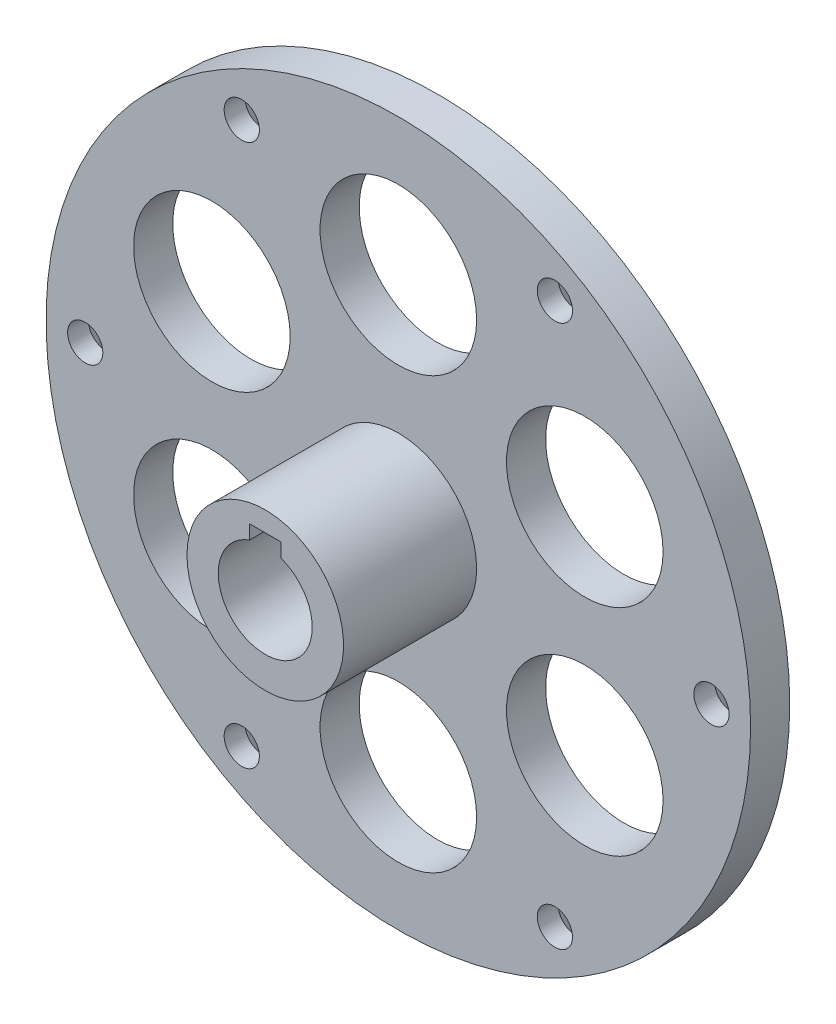
ISO-10303-21;
HEADER;
FILE_DESCRIPTION(('STEP AP214'),'2;1');
FILE_NAME('part.step','',(''),(''),'','','');
FILE_SCHEMA(('AUTOMOTIVE_DESIGN { 1 0 10303 214 1 1 1 1 }'));
ENDSEC;
DATA;
#1=APPLICATION_CONTEXT('core data for automotive mechanical design processes');
#2=APPLICATION_PROTOCOL_DEFINITION('international standard','automotive_design',2000,#1);
#3=PRODUCT_CONTEXT('',#1,'mechanical');
#4=PRODUCT('Part','Part','',(#3));
#5=PRODUCT_RELATED_PRODUCT_CATEGORY('part','',(#4));
#6=PRODUCT_DEFINITION_FORMATION('','',#4);
#7=PRODUCT_DEFINITION_CONTEXT('part definition',#1,'design');
#8=PRODUCT_DEFINITION('design','',#6,#7);
#9=PRODUCT_DEFINITION_SHAPE('','',#8);
#10=(LENGTH_UNIT() NAMED_UNIT(*) SI_UNIT(.MILLI.,.METRE.));
#11=(NAMED_UNIT(*) PLANE_ANGLE_UNIT() SI_UNIT($,.RADIAN.));
#12=(NAMED_UNIT(*) SI_UNIT($,.STERADIAN.) SOLID_ANGLE_UNIT());
#13=UNCERTAINTY_MEASURE_WITH_UNIT(LENGTH_MEASURE(1.E-05),#10,'distance_accuracy_value','');
#14=(GEOMETRIC_REPRESENTATION_CONTEXT(3) GLOBAL_UNCERTAINTY_ASSIGNED_CONTEXT((#13)) GLOBAL_UNIT_ASSIGNED_CONTEXT((#10,
#11,#12)) REPRESENTATION_CONTEXT('',''));
#15=CARTESIAN_POINT('',(0.,0.,0.));
#16=DIRECTION('',(0.,0.,1.));
#17=DIRECTION('',(1.,0.,0.));
#18=AXIS2_PLACEMENT_3D('',#15,#16,#17);
#19=CARTESIAN_POINT('',(0.,0.,5.));
#20=DIRECTION('',(0.,0.,1.));
#21=DIRECTION('',(1.,0.,0.));
#22=AXIS2_PLACEMENT_3D('',#19,#20,#21);
#23=PLANE('',#22);
#24=CARTESIAN_POINT('',(-40.,4.71844785465692E-13,5.));
#25=DIRECTION('',(0.,0.,1.));
#26=DIRECTION('',(1.,0.,0.));
#27=AXIS2_PLACEMENT_3D('',#24,#25,#26);
#28=CIRCLE('',#27,2.25);
#29=CARTESIAN_POINT('',(-37.75,4.71844785465692E-13,5.));
#30=VERTEX_POINT('',#29);
#31=EDGE_CURVE('E36',#30,#30,#28,.T.);
#32=ORIENTED_EDGE('',*,*,#31,.F.);
#33=EDGE_LOOP('',(#32));
#34=FACE_BOUND('',#33,.T.);
#35=CARTESIAN_POINT('',(-20.0000000000003,-34.6410161513774,5.));
#36=DIRECTION('',(0.,0.,1.));
#37=DIRECTION('',(1.,0.,0.));
#38=AXIS2_PLACEMENT_3D('',#35,#36,#37);
#39=CIRCLE('',#38,2.25);
#40=CARTESIAN_POINT('',(-17.7500000000003,-34.6410161513774,5.));
#41=VERTEX_POINT('',#40);
#42=EDGE_CURVE('E151',#41,#41,#39,.T.);
#43=ORIENTED_EDGE('',*,*,#42,.F.);
#44=EDGE_LOOP('',(#43));
#45=FACE_BOUND('',#44,.T.);
#46=CARTESIAN_POINT('',(19.9999999999998,-34.6410161513777,5.));
#47=DIRECTION('',(0.,0.,1.));
#48=DIRECTION('',(1.,0.,0.));
#49=AXIS2_PLACEMENT_3D('',#46,#47,#48);
#50=CIRCLE('',#49,2.25);
#51=CARTESIAN_POINT('',(22.2499999999997,-34.6410161513777,5.));
#52=VERTEX_POINT('',#51);
#53=EDGE_CURVE('E147',#52,#52,#50,.T.);
#54=ORIENTED_EDGE('',*,*,#53,.F.);
#55=EDGE_LOOP('',(#54));
#56=FACE_BOUND('',#55,.T.);
#57=CARTESIAN_POINT('',(40.,-1.90819582357449E-13,5.));
#58=DIRECTION('',(0.,0.,1.));
#59=DIRECTION('',(1.,0.,0.));
#60=AXIS2_PLACEMENT_3D('',#57,#58,#59);
#61=CIRCLE('',#60,2.25);
#62=CARTESIAN_POINT('',(42.25,-1.90819582357449E-13,5.));
#63=VERTEX_POINT('',#62);
#64=EDGE_CURVE('E142',#63,#63,#61,.T.);
#65=ORIENTED_EDGE('',*,*,#64,.F.);
#66=EDGE_LOOP('',(#65));
#67=FACE_BOUND('',#66,.T.);
#68=CARTESIAN_POINT('',(20.0000000000001,34.6410161513775,5.));
#69=DIRECTION('',(0.,0.,1.));
#70=DIRECTION('',(1.,0.,0.));
#71=AXIS2_PLACEMENT_3D('',#68,#69,#70);
#72=CIRCLE('',#71,2.25);
#73=CARTESIAN_POINT('',(22.2500000000001,34.6410161513775,5.));
#74=VERTEX_POINT('',#73);
#75=EDGE_CURVE('E137',#74,#74,#72,.T.);
#76=ORIENTED_EDGE('',*,*,#75,.F.);
#77=EDGE_LOOP('',(#76));
#78=FACE_BOUND('',#77,.T.);
#79=CARTESIAN_POINT('',(-20.,34.6410161513775,5.));
#80=DIRECTION('',(0.,0.,1.));
#81=DIRECTION('',(1.,0.,0.));
#82=AXIS2_PLACEMENT_3D('',#79,#80,#81);
#83=CIRCLE('',#82,2.25);
#84=CARTESIAN_POINT('',(-17.75,34.6410161513775,5.));
#85=VERTEX_POINT('',#84);
#86=EDGE_CURVE('E84',#85,#85,#83,.T.);
#87=ORIENTED_EDGE('',*,*,#86,.F.);
#88=EDGE_LOOP('',(#87));
#89=FACE_BOUND('',#88,.T.);
#90=CARTESIAN_POINT('',(-23.8156986040721,13.75,5.));
#91=DIRECTION('',(0.,0.,1.));
#92=DIRECTION('',(1.,0.,0.));
#93=AXIS2_PLACEMENT_3D('',#90,#91,#92);
#94=CIRCLE('',#93,10.);
#95=CARTESIAN_POINT('',(-13.8156986040721,13.75,5.));
#96=VERTEX_POINT('',#95);
#97=EDGE_CURVE('E133',#96,#96,#94,.T.);
#98=ORIENTED_EDGE('',*,*,#97,.F.);
#99=EDGE_LOOP('',(#98));
#100=FACE_BOUND('',#99,.T.);
#101=CARTESIAN_POINT('',(-23.8156986040721,-13.75,5.));
#102=DIRECTION('',(0.,0.,1.));
#103=DIRECTION('',(1.,0.,0.));
#104=AXIS2_PLACEMENT_3D('',#101,#102,#103);
#105=CIRCLE('',#104,10.);
#106=CARTESIAN_POINT('',(-13.8156986040721,-13.75,5.));
#107=VERTEX_POINT('',#106);
#108=EDGE_CURVE('E129',#107,#107,#105,.T.);
#109=ORIENTED_EDGE('',*,*,#108,.F.);
#110=EDGE_LOOP('',(#109));
#111=FACE_BOUND('',#110,.T.);
#112=CARTESIAN_POINT('',(0.,-27.5,5.));
#113=DIRECTION('',(0.,0.,1.));
#114=DIRECTION('',(1.,0.,0.));
#115=AXIS2_PLACEMENT_3D('',#112,#113,#114);
#116=CIRCLE('',#115,10.);
#117=CARTESIAN_POINT('',(10.,-27.5,5.));
#118=VERTEX_POINT('',#117);
#119=EDGE_CURVE('E125',#118,#118,#116,.T.);
#120=ORIENTED_EDGE('',*,*,#119,.F.);
#121=EDGE_LOOP('',(#120));
#122=FACE_BOUND('',#121,.T.);
#123=CARTESIAN_POINT('',(23.8156986040721,-13.75,5.));
#124=DIRECTION('',(0.,0.,1.));
#125=DIRECTION('',(1.,0.,0.));
#126=AXIS2_PLACEMENT_3D('',#123,#124,#125);
#127=CIRCLE('',#126,10.);
#128=CARTESIAN_POINT('',(33.8156986040721,-13.75,5.));
#129=VERTEX_POINT('',#128);
#130=EDGE_CURVE('E121',#129,#129,#127,.T.);
#131=ORIENTED_EDGE('',*,*,#130,.F.);
#132=EDGE_LOOP('',(#131));
#133=FACE_BOUND('',#132,.T.);
#134=CARTESIAN_POINT('',(0.,27.5,5.));
#135=DIRECTION('',(0.,0.,1.));
#136=DIRECTION('',(1.,0.,0.));
#137=AXIS2_PLACEMENT_3D('',#134,#135,#136);
#138=CIRCLE('',#137,10.);
#139=CARTESIAN_POINT('',(10.,27.5,5.));
#140=VERTEX_POINT('',#139);
#141=EDGE_CURVE('E117',#140,#140,#138,.T.);
#142=ORIENTED_EDGE('',*,*,#141,.F.);
#143=EDGE_LOOP('',(#142));
#144=FACE_BOUND('',#143,.T.);
#145=CARTESIAN_POINT('',(23.8156986040721,13.75,5.));
#146=DIRECTION('',(0.,0.,1.));
#147=DIRECTION('',(1.,0.,0.));
#148=AXIS2_PLACEMENT_3D('',#145,#146,#147);
#149=CIRCLE('',#148,10.);
#150=CARTESIAN_POINT('',(33.8156986040721,13.75,5.));
#151=VERTEX_POINT('',#150);
#152=EDGE_CURVE('E103',#151,#151,#149,.T.);
#153=ORIENTED_EDGE('',*,*,#152,.F.);
#154=EDGE_LOOP('',(#153));
#155=FACE_BOUND('',#154,.T.);
#156=CARTESIAN_POINT('',(0.,0.,5.));
#157=DIRECTION('',(0.,0.,1.));
#158=DIRECTION('',(1.,0.,0.));
#159=AXIS2_PLACEMENT_3D('',#156,#157,#158);
#160=CIRCLE('',#159,10.);
#161=CARTESIAN_POINT('',(10.,0.,5.));
#162=VERTEX_POINT('',#161);
#163=EDGE_CURVE('E11',#162,#162,#160,.T.);
#164=ORIENTED_EDGE('',*,*,#163,.F.);
#165=EDGE_LOOP('',(#164));
#166=FACE_BOUND('',#165,.T.);
#167=CARTESIAN_POINT('',(0.,0.,5.));
#168=DIRECTION('',(0.,0.,1.));
#169=DIRECTION('',(1.,0.,0.));
#170=AXIS2_PLACEMENT_3D('',#167,#168,#169);
#171=CIRCLE('',#170,45.);
#172=CARTESIAN_POINT('',(45.,0.,5.));
#173=VERTEX_POINT('',#172);
#174=EDGE_CURVE('E41',#173,#173,#171,.T.);
#175=ORIENTED_EDGE('',*,*,#174,.T.);
#176=EDGE_LOOP('',(#175));
#177=FACE_BOUND('',#176,.T.);
#178=ADVANCED_FACE('F32',(#34,#45,#56,#67,#78,#89,#100,#111,#122,#133,#144,#155,#166,#177),#23,.T.);
#179=CARTESIAN_POINT('',(0.,0.,0.));
#180=DIRECTION('',(0.,0.,1.));
#181=DIRECTION('',(1.,0.,0.));
#182=AXIS2_PLACEMENT_3D('',#179,#180,#181);
#183=PLANE('',#182);
#184=CARTESIAN_POINT('',(-40.,4.71844785465692E-13,0.));
#185=DIRECTION('',(0.,0.,-1.));
#186=DIRECTION('',(-1.,0.,0.));
#187=AXIS2_PLACEMENT_3D('',#184,#185,#186);
#188=CIRCLE('',#187,4.59);
#189=CARTESIAN_POINT('',(-44.59,4.71844785465692E-13,0.));
#190=VERTEX_POINT('',#189);
#191=EDGE_CURVE('E459',#190,#190,#188,.T.);
#192=ORIENTED_EDGE('',*,*,#191,.F.);
#193=EDGE_LOOP('',(#192));
#194=FACE_BOUND('',#193,.T.);
#195=CARTESIAN_POINT('',(-20.0000000000003,-34.6410161513774,0.));
#196=DIRECTION('',(0.,0.,-1.));
#197=DIRECTION('',(-1.,0.,0.));
#198=AXIS2_PLACEMENT_3D('',#195,#196,#197);
#199=CIRCLE('',#198,4.59);
#200=CARTESIAN_POINT('',(-24.5900000000003,-34.6410161513774,0.));
#201=VERTEX_POINT('',#200);
#202=EDGE_CURVE('E154',#201,#201,#199,.T.);
#203=ORIENTED_EDGE('',*,*,#202,.F.);
#204=EDGE_LOOP('',(#203));
#205=FACE_BOUND('',#204,.T.);
#206=CARTESIAN_POINT('',(19.9999999999998,-34.6410161513777,0.));
#207=DIRECTION('',(0.,0.,-1.));
#208=DIRECTION('',(-1.,0.,0.));
#209=AXIS2_PLACEMENT_3D('',#206,#207,#208);
#210=CIRCLE('',#209,4.59);
#211=CARTESIAN_POINT('',(15.4099999999997,-34.6410161513777,0.));
#212=VERTEX_POINT('',#211);
#213=EDGE_CURVE('E150',#212,#212,#210,.T.);
#214=ORIENTED_EDGE('',*,*,#213,.F.);
#215=EDGE_LOOP('',(#214));
#216=FACE_BOUND('',#215,.T.);
#217=CARTESIAN_POINT('',(40.,-1.90819582357449E-13,0.));
#218=DIRECTION('',(0.,0.,-1.));
#219=DIRECTION('',(-1.,0.,0.));
#220=AXIS2_PLACEMENT_3D('',#217,#218,#219);
#221=CIRCLE('',#220,4.59);
#222=CARTESIAN_POINT('',(35.41,-1.90819582357449E-13,0.));
#223=VERTEX_POINT('',#222);
#224=EDGE_CURVE('E146',#223,#223,#221,.T.);
#225=ORIENTED_EDGE('',*,*,#224,.F.);
#226=EDGE_LOOP('',(#225));
#227=FACE_BOUND('',#226,.T.);
#228=CARTESIAN_POINT('',(20.0000000000001,34.6410161513775,0.));
#229=DIRECTION('',(0.,0.,-1.));
#230=DIRECTION('',(-1.,0.,0.));
#231=AXIS2_PLACEMENT_3D('',#228,#229,#230);
#232=CIRCLE('',#231,4.59);
#233=CARTESIAN_POINT('',(15.4100000000001,34.6410161513775,0.));
#234=VERTEX_POINT('',#233);
#235=EDGE_CURVE('E141',#234,#234,#232,.T.);
#236=ORIENTED_EDGE('',*,*,#235,.F.);
#237=EDGE_LOOP('',(#236));
#238=FACE_BOUND('',#237,.T.);
#239=CARTESIAN_POINT('',(-20.,34.6410161513775,0.));
#240=DIRECTION('',(0.,0.,-1.));
#241=DIRECTION('',(-1.,0.,0.));
#242=AXIS2_PLACEMENT_3D('',#239,#240,#241);
#243=CIRCLE('',#242,4.59);
#244=CARTESIAN_POINT('',(-24.59,34.6410161513775,0.));
#245=VERTEX_POINT('',#244);
#246=EDGE_CURVE('E136',#245,#245,#243,.T.);
#247=ORIENTED_EDGE('',*,*,#246,.F.);
#248=EDGE_LOOP('',(#247));
#249=FACE_BOUND('',#248,.T.);
#250=CARTESIAN_POINT('',(-23.8156986040721,13.75,0.));
#251=DIRECTION('',(0.,0.,1.));
#252=DIRECTION('',(1.,0.,0.));
#253=AXIS2_PLACEMENT_3D('',#250,#251,#252);
#254=CIRCLE('',#253,10.);
#255=CARTESIAN_POINT('',(-13.8156986040721,13.75,0.));
#256=VERTEX_POINT('',#255);
#257=EDGE_CURVE('E130',#256,#256,#254,.T.);
#258=ORIENTED_EDGE('',*,*,#257,.T.);
#259=EDGE_LOOP('',(#258));
#260=FACE_BOUND('',#259,.T.);
#261=CARTESIAN_POINT('',(-23.8156986040721,-13.75,0.));
#262=DIRECTION('',(0.,0.,1.));
#263=DIRECTION('',(1.,0.,0.));
#264=AXIS2_PLACEMENT_3D('',#261,#262,#263);
#265=CIRCLE('',#264,10.);
#266=CARTESIAN_POINT('',(-13.8156986040721,-13.75,0.));
#267=VERTEX_POINT('',#266);
#268=EDGE_CURVE('E126',#267,#267,#265,.T.);
#269=ORIENTED_EDGE('',*,*,#268,.T.);
#270=EDGE_LOOP('',(#269));
#271=FACE_BOUND('',#270,.T.);
#272=CARTESIAN_POINT('',(0.,-27.5,0.));
#273=DIRECTION('',(0.,0.,1.));
#274=DIRECTION('',(1.,0.,0.));
#275=AXIS2_PLACEMENT_3D('',#272,#273,#274);
#276=CIRCLE('',#275,10.);
#277=CARTESIAN_POINT('',(10.,-27.5,0.));
#278=VERTEX_POINT('',#277);
#279=EDGE_CURVE('E122',#278,#278,#276,.T.);
#280=ORIENTED_EDGE('',*,*,#279,.T.);
#281=EDGE_LOOP('',(#280));
#282=FACE_BOUND('',#281,.T.);
#283=CARTESIAN_POINT('',(23.8156986040721,-13.75,0.));
#284=DIRECTION('',(0.,0.,1.));
#285=DIRECTION('',(1.,0.,0.));
#286=AXIS2_PLACEMENT_3D('',#283,#284,#285);
#287=CIRCLE('',#286,10.);
#288=CARTESIAN_POINT('',(33.8156986040721,-13.75,0.));
#289=VERTEX_POINT('',#288);
#290=EDGE_CURVE('E118',#289,#289,#287,.T.);
#291=ORIENTED_EDGE('',*,*,#290,.T.);
#292=EDGE_LOOP('',(#291));
#293=FACE_BOUND('',#292,.T.);
#294=CARTESIAN_POINT('',(0.,27.5,0.));
#295=DIRECTION('',(0.,0.,1.));
#296=DIRECTION('',(1.,0.,0.));
#297=AXIS2_PLACEMENT_3D('',#294,#295,#296);
#298=CIRCLE('',#297,10.);
#299=CARTESIAN_POINT('',(10.,27.5,0.));
#300=VERTEX_POINT('',#299);
#301=EDGE_CURVE('E114',#300,#300,#298,.T.);
#302=ORIENTED_EDGE('',*,*,#301,.T.);
#303=EDGE_LOOP('',(#302));
#304=FACE_BOUND('',#303,.T.);
#305=CARTESIAN_POINT('',(23.8156986040721,13.75,0.));
#306=DIRECTION('',(0.,0.,1.));
#307=DIRECTION('',(1.,0.,0.));
#308=AXIS2_PLACEMENT_3D('',#305,#306,#307);
#309=CIRCLE('',#308,10.);
#310=CARTESIAN_POINT('',(33.8156986040721,13.75,0.));
#311=VERTEX_POINT('',#310);
#312=EDGE_CURVE('E98',#311,#311,#309,.T.);
#313=ORIENTED_EDGE('',*,*,#312,.T.);
#314=EDGE_LOOP('',(#313));
#315=FACE_BOUND('',#314,.T.);
#316=CARTESIAN_POINT('',(0.,0.,0.));
#317=DIRECTION('',(0.,0.,1.));
#318=DIRECTION('',(1.,0.,0.));
#319=AXIS2_PLACEMENT_3D('',#316,#317,#318);
#320=CIRCLE('',#319,45.);
#321=CARTESIAN_POINT('',(45.,0.,0.));
#322=VERTEX_POINT('',#321);
#323=EDGE_CURVE('E109',#322,#322,#320,.T.);
#324=ORIENTED_EDGE('',*,*,#323,.F.);
#325=EDGE_LOOP('',(#324));
#326=FACE_BOUND('',#325,.T.);
#327=DIRECTION('',(-1.,0.,0.));
#328=VECTOR('',#327,1.);
#329=CARTESIAN_POINT('',(0.,7.45685424949238,0.));
#330=LINE('',#329,#328);
#331=CARTESIAN_POINT('',(2.,7.45685424949238,0.));
#332=VERTEX_POINT('',#331);
#333=CARTESIAN_POINT('',(-2.,7.45685424949238,0.));
#334=VERTEX_POINT('',#333);
#335=EDGE_CURVE('E191',#332,#334,#330,.T.);
#336=ORIENTED_EDGE('',*,*,#335,.T.);
#337=DIRECTION('',(0.,-1.,0.));
#338=VECTOR('',#337,1.);
#339=CARTESIAN_POINT('',(-2.,0.,0.));
#340=LINE('',#339,#338);
#341=CARTESIAN_POINT('',(-2.,5.65685424949238,0.));
#342=VERTEX_POINT('',#341);
#343=EDGE_CURVE('E57',#334,#342,#340,.T.);
#344=ORIENTED_EDGE('',*,*,#343,.T.);
#345=CARTESIAN_POINT('',(0.,0.,0.));
#346=DIRECTION('',(0.,0.,1.));
#347=DIRECTION('',(1.,0.,0.));
#348=AXIS2_PLACEMENT_3D('',#345,#346,#347);
#349=CIRCLE('',#348,6.);
#350=CARTESIAN_POINT('',(2.,5.65685424949238,0.));
#351=VERTEX_POINT('',#350);
#352=EDGE_CURVE('E92',#342,#351,#349,.T.);
#353=ORIENTED_EDGE('',*,*,#352,.T.);
#354=DIRECTION('',(0.,1.,0.));
#355=VECTOR('',#354,1.);
#356=CARTESIAN_POINT('',(2.,0.,0.));
#357=LINE('',#356,#355);
#358=EDGE_CURVE('E185',#351,#332,#357,.T.);
#359=ORIENTED_EDGE('',*,*,#358,.T.);
#360=EDGE_LOOP('',(#336,#344,#353,#359));
#361=FACE_BOUND('',#360,.T.);
#362=ADVANCED_FACE('F210',(#194,#205,#216,#227,#238,#249,#260,#271,#282,#293,#304,#315,#326,
#361),#183,.F.);
#363=CARTESIAN_POINT('',(0.,0.,5.));
#364=DIRECTION('',(0.,0.,-1.));
#365=DIRECTION('',(-1.,0.,0.));
#366=AXIS2_PLACEMENT_3D('',#363,#364,#365);
#367=CYLINDRICAL_SURFACE('',#366,45.);
#368=ORIENTED_EDGE('',*,*,#174,.F.);
#369=EDGE_LOOP('',(#368));
#370=FACE_BOUND('',#369,.T.);
#371=ORIENTED_EDGE('',*,*,#323,.T.);
#372=EDGE_LOOP('',(#371));
#373=FACE_BOUND('',#372,.T.);
#374=ADVANCED_FACE('F34',(#370,#373),#367,.T.);
#375=CARTESIAN_POINT('',(0.,0.,5.));
#376=DIRECTION('',(0.,0.,-1.));
#377=DIRECTION('',(-1.,0.,0.));
#378=AXIS2_PLACEMENT_3D('',#375,#376,#377);
#379=CYLINDRICAL_SURFACE('',#378,6.);
#380=DIRECTION('',(0.,0.,1.));
#381=VECTOR('',#380,1.);
#382=CARTESIAN_POINT('',(-2.,5.65685424949238,-28.));
#383=LINE('',#382,#381);
#384=CARTESIAN_POINT('',(-2.,5.65685424949238,22.));
#385=VERTEX_POINT('',#384);
#386=EDGE_CURVE('E77',#342,#385,#383,.T.);
#387=ORIENTED_EDGE('',*,*,#386,.T.);
#388=CARTESIAN_POINT('',(0.,0.,22.));
#389=DIRECTION('',(0.,0.,-1.));
#390=DIRECTION('',(-1.,0.,0.));
#391=AXIS2_PLACEMENT_3D('',#388,#389,#390);
#392=CIRCLE('',#391,6.);
#393=CARTESIAN_POINT('',(2.,5.65685424949238,22.));
#394=VERTEX_POINT('',#393);
#395=EDGE_CURVE('E90',#394,#385,#392,.T.);
#396=ORIENTED_EDGE('',*,*,#395,.F.);
#397=DIRECTION('',(0.,0.,1.));
#398=VECTOR('',#397,1.);
#399=CARTESIAN_POINT('',(2.,5.65685424949238,-28.));
#400=LINE('',#399,#398);
#401=EDGE_CURVE('E49',#351,#394,#400,.T.);
#402=ORIENTED_EDGE('',*,*,#401,.F.);
#403=ORIENTED_EDGE('',*,*,#352,.F.);
#404=EDGE_LOOP('',(#387,#396,#402,#403));
#405=FACE_BOUND('',#404,.T.);
#406=ADVANCED_FACE('F89',(#405),#379,.F.);
#407=CARTESIAN_POINT('',(0.,0.,22.));
#408=DIRECTION('',(0.,0.,-1.));
#409=DIRECTION('',(-1.,0.,0.));
#410=AXIS2_PLACEMENT_3D('',#407,#408,#409);
#411=CYLINDRICAL_SURFACE('',#410,10.);
#412=ORIENTED_EDGE('',*,*,#163,.T.);
#413=EDGE_LOOP('',(#412));
#414=FACE_BOUND('',#413,.T.);
#415=CARTESIAN_POINT('',(0.,0.,22.));
#416=DIRECTION('',(0.,0.,-1.));
#417=DIRECTION('',(-1.,0.,0.));
#418=AXIS2_PLACEMENT_3D('',#415,#416,#417);
#419=CIRCLE('',#418,10.);
#420=CARTESIAN_POINT('',(-10.,0.,22.));
#421=VERTEX_POINT('',#420);
#422=EDGE_CURVE('E97',#421,#421,#419,.T.);
#423=ORIENTED_EDGE('',*,*,#422,.T.);
#424=EDGE_LOOP('',(#423));
#425=FACE_BOUND('',#424,.T.);
#426=ADVANCED_FACE('F269',(#414,#425),#411,.T.);
#427=CARTESIAN_POINT('',(0.,0.,22.));
#428=DIRECTION('',(0.,0.,-1.));
#429=DIRECTION('',(-1.,0.,0.));
#430=AXIS2_PLACEMENT_3D('',#427,#428,#429);
#431=PLANE('',#430);
#432=ORIENTED_EDGE('',*,*,#395,.T.);
#433=DIRECTION('',(0.,-1.,0.));
#434=VECTOR('',#433,1.);
#435=CARTESIAN_POINT('',(-2.,7.45685424949238,22.));
#436=LINE('',#435,#434);
#437=CARTESIAN_POINT('',(-2.,7.45685424949238,22.));
#438=VERTEX_POINT('',#437);
#439=EDGE_CURVE('E74',#438,#385,#436,.T.);
#440=ORIENTED_EDGE('',*,*,#439,.F.);
#441=DIRECTION('',(-1.,0.,0.));
#442=VECTOR('',#441,1.);
#443=CARTESIAN_POINT('',(2.,7.45685424949238,22.));
#444=LINE('',#443,#442);
#445=CARTESIAN_POINT('',(2.,7.45685424949238,22.));
#446=VERTEX_POINT('',#445);
#447=EDGE_CURVE('E93',#446,#438,#444,.T.);
#448=ORIENTED_EDGE('',*,*,#447,.F.);
#449=DIRECTION('',(0.,1.,0.));
#450=VECTOR('',#449,1.);
#451=CARTESIAN_POINT('',(2.,7.45685424949238,22.));
#452=LINE('',#451,#450);
#453=EDGE_CURVE('E83',#394,#446,#452,.T.);
#454=ORIENTED_EDGE('',*,*,#453,.F.);
#455=EDGE_LOOP('',(#432,#440,#448,#454));
#456=FACE_BOUND('',#455,.T.);
#457=ORIENTED_EDGE('',*,*,#422,.F.);
#458=EDGE_LOOP('',(#457));
#459=FACE_BOUND('',#458,.T.);
#460=ADVANCED_FACE('F95',(#456,#459),#431,.F.);
#461=CARTESIAN_POINT('',(23.8156986040721,13.75,-95.));
#462=DIRECTION('',(0.,0.,1.));
#463=DIRECTION('',(1.,0.,0.));
#464=AXIS2_PLACEMENT_3D('',#461,#462,#463);
#465=CYLINDRICAL_SURFACE('',#464,10.);
#466=ORIENTED_EDGE('',*,*,#152,.T.);
#467=EDGE_LOOP('',(#466));
#468=FACE_BOUND('',#467,.T.);
#469=ORIENTED_EDGE('',*,*,#312,.F.);
#470=EDGE_LOOP('',(#469));
#471=FACE_BOUND('',#470,.T.);
#472=ADVANCED_FACE('F263',(#468,#471),#465,.F.);
#473=CARTESIAN_POINT('',(0.,27.5,-95.));
#474=DIRECTION('',(0.,0.,1.));
#475=DIRECTION('',(1.,0.,0.));
#476=AXIS2_PLACEMENT_3D('',#473,#474,#475);
#477=CYLINDRICAL_SURFACE('',#476,10.);
#478=ORIENTED_EDGE('',*,*,#141,.T.);
#479=EDGE_LOOP('',(#478));
#480=FACE_BOUND('',#479,.T.);
#481=ORIENTED_EDGE('',*,*,#301,.F.);
#482=EDGE_LOOP('',(#481));
#483=FACE_BOUND('',#482,.T.);
#484=ADVANCED_FACE('F205',(#480,#483),#477,.F.);
#485=CARTESIAN_POINT('',(23.8156986040721,-13.75,-95.));
#486=DIRECTION('',(0.,0.,1.));
#487=DIRECTION('',(1.,0.,0.));
#488=AXIS2_PLACEMENT_3D('',#485,#486,#487);
#489=CYLINDRICAL_SURFACE('',#488,10.);
#490=ORIENTED_EDGE('',*,*,#130,.T.);
#491=EDGE_LOOP('',(#490));
#492=FACE_BOUND('',#491,.T.);
#493=ORIENTED_EDGE('',*,*,#290,.F.);
#494=EDGE_LOOP('',(#493));
#495=FACE_BOUND('',#494,.T.);
#496=ADVANCED_FACE('F256',(#492,#495),#489,.F.);
#497=CARTESIAN_POINT('',(0.,-27.5,-95.));
#498=DIRECTION('',(0.,0.,1.));
#499=DIRECTION('',(1.,0.,0.));
#500=AXIS2_PLACEMENT_3D('',#497,#498,#499);
#501=CYLINDRICAL_SURFACE('',#500,10.);
#502=ORIENTED_EDGE('',*,*,#119,.T.);
#503=EDGE_LOOP('',(#502));
#504=FACE_BOUND('',#503,.T.);
#505=ORIENTED_EDGE('',*,*,#279,.F.);
#506=EDGE_LOOP('',(#505));
#507=FACE_BOUND('',#506,.T.);
#508=ADVANCED_FACE('F252',(#504,#507),#501,.F.);
#509=CARTESIAN_POINT('',(-23.8156986040721,-13.75,-95.));
#510=DIRECTION('',(0.,0.,1.));
#511=DIRECTION('',(1.,0.,0.));
#512=AXIS2_PLACEMENT_3D('',#509,#510,#511);
#513=CYLINDRICAL_SURFACE('',#512,10.);
#514=ORIENTED_EDGE('',*,*,#108,.T.);
#515=EDGE_LOOP('',(#514));
#516=FACE_BOUND('',#515,.T.);
#517=ORIENTED_EDGE('',*,*,#268,.F.);
#518=EDGE_LOOP('',(#517));
#519=FACE_BOUND('',#518,.T.);
#520=ADVANCED_FACE('F248',(#516,#519),#513,.F.);
#521=CARTESIAN_POINT('',(-23.8156986040721,13.75,-95.));
#522=DIRECTION('',(0.,0.,1.));
#523=DIRECTION('',(1.,0.,0.));
#524=AXIS2_PLACEMENT_3D('',#521,#522,#523);
#525=CYLINDRICAL_SURFACE('',#524,10.);
#526=ORIENTED_EDGE('',*,*,#97,.T.);
#527=EDGE_LOOP('',(#526));
#528=FACE_BOUND('',#527,.T.);
#529=ORIENTED_EDGE('',*,*,#257,.F.);
#530=EDGE_LOOP('',(#529));
#531=FACE_BOUND('',#530,.T.);
#532=ADVANCED_FACE('F245',(#528,#531),#525,.F.);
#533=CARTESIAN_POINT('',(-2.,7.45685424949238,-28.));
#534=DIRECTION('',(-1.,0.,0.));
#535=DIRECTION('',(0.,-1.,0.));
#536=AXIS2_PLACEMENT_3D('',#533,#534,#535);
#537=PLANE('',#536);
#538=DIRECTION('',(0.,0.,1.));
#539=VECTOR('',#538,1.);
#540=CARTESIAN_POINT('',(-2.,7.45685424949238,-28.));
#541=LINE('',#540,#539);
#542=EDGE_CURVE('E78',#334,#438,#541,.T.);
#543=ORIENTED_EDGE('',*,*,#542,.T.);
#544=ORIENTED_EDGE('',*,*,#439,.T.);
#545=ORIENTED_EDGE('',*,*,#386,.F.);
#546=ORIENTED_EDGE('',*,*,#343,.F.);
#547=EDGE_LOOP('',(#543,#544,#545,#546));
#548=FACE_BOUND('',#547,.T.);
#549=ADVANCED_FACE('F76',(#548),#537,.F.);
#550=CARTESIAN_POINT('',(2.,7.45685424949238,-28.));
#551=DIRECTION('',(0.,1.,0.));
#552=DIRECTION('',(0.,0.,1.));
#553=AXIS2_PLACEMENT_3D('',#550,#551,#552);
#554=PLANE('',#553);
#555=DIRECTION('',(0.,0.,1.));
#556=VECTOR('',#555,1.);
#557=CARTESIAN_POINT('',(2.,7.45685424949238,-28.));
#558=LINE('',#557,#556);
#559=EDGE_CURVE('E186',#332,#446,#558,.T.);
#560=ORIENTED_EDGE('',*,*,#559,.T.);
#561=ORIENTED_EDGE('',*,*,#447,.T.);
#562=ORIENTED_EDGE('',*,*,#542,.F.);
#563=ORIENTED_EDGE('',*,*,#335,.F.);
#564=EDGE_LOOP('',(#560,#561,#562,#563));
#565=FACE_BOUND('',#564,.T.);
#566=ADVANCED_FACE('F229',(#565),#554,.F.);
#567=CARTESIAN_POINT('',(2.,7.45685424949238,-28.));
#568=DIRECTION('',(1.,0.,0.));
#569=DIRECTION('',(0.,1.,0.));
#570=AXIS2_PLACEMENT_3D('',#567,#568,#569);
#571=PLANE('',#570);
#572=ORIENTED_EDGE('',*,*,#401,.T.);
#573=ORIENTED_EDGE('',*,*,#453,.T.);
#574=ORIENTED_EDGE('',*,*,#559,.F.);
#575=ORIENTED_EDGE('',*,*,#358,.F.);
#576=EDGE_LOOP('',(#572,#573,#574,#575));
#577=FACE_BOUND('',#576,.T.);
#578=ADVANCED_FACE('F230',(#577),#571,.F.);
#579=CARTESIAN_POINT('',(-20.,34.6410161513775,0.));
#580=DIRECTION('',(0.,0.,-1.));
#581=DIRECTION('',(-1.,0.,0.));
#582=AXIS2_PLACEMENT_3D('',#579,#580,#581);
#583=CONICAL_SURFACE('',#582,4.59,0.785398163397448);
#584=CARTESIAN_POINT('',(-20.,34.6410161513775,2.34));
#585=DIRECTION('',(0.,0.,-1.));
#586=DIRECTION('',(-1.,0.,0.));
#587=AXIS2_PLACEMENT_3D('',#584,#585,#586);
#588=CIRCLE('',#587,2.25);
#589=CARTESIAN_POINT('',(-22.25,34.6410161513775,2.34));
#590=VERTEX_POINT('',#589);
#591=EDGE_CURVE('E140',#590,#590,#588,.T.);
#592=ORIENTED_EDGE('',*,*,#591,.F.);
#593=EDGE_LOOP('',(#592));
#594=FACE_BOUND('',#593,.T.);
#595=ORIENTED_EDGE('',*,*,#246,.T.);
#596=EDGE_LOOP('',(#595));
#597=FACE_BOUND('',#596,.T.);
#598=ADVANCED_FACE('F232',(#594,#597),#583,.F.);
#599=CARTESIAN_POINT('',(-20.,34.6410161513775,0.));
#600=DIRECTION('',(0.,0.,-1.));
#601=DIRECTION('',(-1.,0.,0.));
#602=AXIS2_PLACEMENT_3D('',#599,#600,#601);
#603=CYLINDRICAL_SURFACE('',#602,2.25);
#604=ORIENTED_EDGE('',*,*,#86,.T.);
#605=EDGE_LOOP('',(#604));
#606=FACE_BOUND('',#605,.T.);
#607=ORIENTED_EDGE('',*,*,#591,.T.);
#608=EDGE_LOOP('',(#607));
#609=FACE_BOUND('',#608,.T.);
#610=ADVANCED_FACE('F238',(#606,#609),#603,.F.);
#611=CARTESIAN_POINT('',(20.0000000000001,34.6410161513775,0.));
#612=DIRECTION('',(0.,0.,-1.));
#613=DIRECTION('',(-1.,0.,0.));
#614=AXIS2_PLACEMENT_3D('',#611,#612,#613);
#615=CONICAL_SURFACE('',#614,4.59,0.785398163397448);
#616=CARTESIAN_POINT('',(20.0000000000001,34.6410161513775,2.34));
#617=DIRECTION('',(0.,0.,-1.));
#618=DIRECTION('',(-1.,0.,0.));
#619=AXIS2_PLACEMENT_3D('',#616,#617,#618);
#620=CIRCLE('',#619,2.25);
#621=CARTESIAN_POINT('',(17.7500000000001,34.6410161513775,2.34));
#622=VERTEX_POINT('',#621);
#623=EDGE_CURVE('E145',#622,#622,#620,.T.);
#624=ORIENTED_EDGE('',*,*,#623,.F.);
#625=EDGE_LOOP('',(#624));
#626=FACE_BOUND('',#625,.T.);
#627=ORIENTED_EDGE('',*,*,#235,.T.);
#628=EDGE_LOOP('',(#627));
#629=FACE_BOUND('',#628,.T.);
#630=ADVANCED_FACE('F337',(#626,#629),#615,.F.);
#631=CARTESIAN_POINT('',(20.0000000000001,34.6410161513775,0.));
#632=DIRECTION('',(0.,0.,-1.));
#633=DIRECTION('',(-1.,0.,0.));
#634=AXIS2_PLACEMENT_3D('',#631,#632,#633);
#635=CYLINDRICAL_SURFACE('',#634,2.25);
#636=ORIENTED_EDGE('',*,*,#75,.T.);
#637=EDGE_LOOP('',(#636));
#638=FACE_BOUND('',#637,.T.);
#639=ORIENTED_EDGE('',*,*,#623,.T.);
#640=EDGE_LOOP('',(#639));
#641=FACE_BOUND('',#640,.T.);
#642=ADVANCED_FACE('F360',(#638,#641),#635,.F.);
#643=CARTESIAN_POINT('',(40.,-1.90819582357449E-13,0.));
#644=DIRECTION('',(0.,0.,-1.));
#645=DIRECTION('',(-1.,0.,0.));
#646=AXIS2_PLACEMENT_3D('',#643,#644,#645);
#647=CONICAL_SURFACE('',#646,4.59,0.785398163397447);
#648=CARTESIAN_POINT('',(40.,-1.90819582357449E-13,2.34));
#649=DIRECTION('',(0.,0.,-1.));
#650=DIRECTION('',(-1.,0.,0.));
#651=AXIS2_PLACEMENT_3D('',#648,#649,#650);
#652=CIRCLE('',#651,2.25);
#653=CARTESIAN_POINT('',(37.75,-1.90819582357449E-13,2.34));
#654=VERTEX_POINT('',#653);
#655=EDGE_CURVE('E149',#654,#654,#652,.T.);
#656=ORIENTED_EDGE('',*,*,#655,.F.);
#657=EDGE_LOOP('',(#656));
#658=FACE_BOUND('',#657,.T.);
#659=ORIENTED_EDGE('',*,*,#224,.T.);
#660=EDGE_LOOP('',(#659));
#661=FACE_BOUND('',#660,.T.);
#662=ADVANCED_FACE('F370',(#658,#661),#647,.F.);
#663=CARTESIAN_POINT('',(40.,-1.90819582357449E-13,0.));
#664=DIRECTION('',(0.,0.,-1.));
#665=DIRECTION('',(-1.,0.,0.));
#666=AXIS2_PLACEMENT_3D('',#663,#664,#665);
#667=CYLINDRICAL_SURFACE('',#666,2.25);
#668=ORIENTED_EDGE('',*,*,#64,.T.);
#669=EDGE_LOOP('',(#668));
#670=FACE_BOUND('',#669,.T.);
#671=ORIENTED_EDGE('',*,*,#655,.T.);
#672=EDGE_LOOP('',(#671));
#673=FACE_BOUND('',#672,.T.);
#674=ADVANCED_FACE('F380',(#670,#673),#667,.F.);
#675=CARTESIAN_POINT('',(19.9999999999998,-34.6410161513777,0.));
#676=DIRECTION('',(0.,0.,-1.));
#677=DIRECTION('',(-1.,0.,0.));
#678=AXIS2_PLACEMENT_3D('',#675,#676,#677);
#679=CONICAL_SURFACE('',#678,4.59,0.785398163397448);
#680=CARTESIAN_POINT('',(19.9999999999998,-34.6410161513777,2.34));
#681=DIRECTION('',(0.,0.,-1.));
#682=DIRECTION('',(-1.,0.,0.));
#683=AXIS2_PLACEMENT_3D('',#680,#681,#682);
#684=CIRCLE('',#683,2.25);
#685=CARTESIAN_POINT('',(17.7499999999998,-34.6410161513777,2.34));
#686=VERTEX_POINT('',#685);
#687=EDGE_CURVE('E153',#686,#686,#684,.T.);
#688=ORIENTED_EDGE('',*,*,#687,.F.);
#689=EDGE_LOOP('',(#688));
#690=FACE_BOUND('',#689,.T.);
#691=ORIENTED_EDGE('',*,*,#213,.T.);
#692=EDGE_LOOP('',(#691));
#693=FACE_BOUND('',#692,.T.);
#694=ADVANCED_FACE('F390',(#690,#693),#679,.F.);
#695=CARTESIAN_POINT('',(19.9999999999998,-34.6410161513777,0.));
#696=DIRECTION('',(0.,0.,-1.));
#697=DIRECTION('',(-1.,0.,0.));
#698=AXIS2_PLACEMENT_3D('',#695,#696,#697);
#699=CYLINDRICAL_SURFACE('',#698,2.25);
#700=ORIENTED_EDGE('',*,*,#53,.T.);
#701=EDGE_LOOP('',(#700));
#702=FACE_BOUND('',#701,.T.);
#703=ORIENTED_EDGE('',*,*,#687,.T.);
#704=EDGE_LOOP('',(#703));
#705=FACE_BOUND('',#704,.T.);
#706=ADVANCED_FACE('F400',(#702,#705),#699,.F.);
#707=CARTESIAN_POINT('',(-20.0000000000003,-34.6410161513774,0.));
#708=DIRECTION('',(0.,0.,-1.));
#709=DIRECTION('',(-1.,0.,0.));
#710=AXIS2_PLACEMENT_3D('',#707,#708,#709);
#711=CONICAL_SURFACE('',#710,4.59,0.785398163397448);
#712=CARTESIAN_POINT('',(-20.0000000000003,-34.6410161513774,2.34));
#713=DIRECTION('',(0.,0.,-1.));
#714=DIRECTION('',(-1.,0.,0.));
#715=AXIS2_PLACEMENT_3D('',#712,#713,#714);
#716=CIRCLE('',#715,2.25);
#717=CARTESIAN_POINT('',(-22.2500000000003,-34.6410161513774,2.34));
#718=VERTEX_POINT('',#717);
#719=EDGE_CURVE('E160',#718,#718,#716,.T.);
#720=ORIENTED_EDGE('',*,*,#719,.F.);
#721=EDGE_LOOP('',(#720));
#722=FACE_BOUND('',#721,.T.);
#723=ORIENTED_EDGE('',*,*,#202,.T.);
#724=EDGE_LOOP('',(#723));
#725=FACE_BOUND('',#724,.T.);
#726=ADVANCED_FACE('F410',(#722,#725),#711,.F.);
#727=CARTESIAN_POINT('',(-20.0000000000003,-34.6410161513774,0.));
#728=DIRECTION('',(0.,0.,-1.));
#729=DIRECTION('',(-1.,0.,0.));
#730=AXIS2_PLACEMENT_3D('',#727,#728,#729);
#731=CYLINDRICAL_SURFACE('',#730,2.25);
#732=ORIENTED_EDGE('',*,*,#42,.T.);
#733=EDGE_LOOP('',(#732));
#734=FACE_BOUND('',#733,.T.);
#735=ORIENTED_EDGE('',*,*,#719,.T.);
#736=EDGE_LOOP('',(#735));
#737=FACE_BOUND('',#736,.T.);
#738=ADVANCED_FACE('F420',(#734,#737),#731,.F.);
#739=CARTESIAN_POINT('',(-40.,4.71844785465692E-13,0.));
#740=DIRECTION('',(0.,0.,-1.));
#741=DIRECTION('',(-1.,0.,0.));
#742=AXIS2_PLACEMENT_3D('',#739,#740,#741);
#743=CONICAL_SURFACE('',#742,4.59,0.785398163397447);
#744=CARTESIAN_POINT('',(-40.,4.71844785465692E-13,2.34));
#745=DIRECTION('',(0.,0.,-1.));
#746=DIRECTION('',(-1.,0.,0.));
#747=AXIS2_PLACEMENT_3D('',#744,#745,#746);
#748=CIRCLE('',#747,2.25);
#749=CARTESIAN_POINT('',(-42.25,4.71844785465692E-13,2.34));
#750=VERTEX_POINT('',#749);
#751=EDGE_CURVE('E458',#750,#750,#748,.T.);
#752=ORIENTED_EDGE('',*,*,#751,.F.);
#753=EDGE_LOOP('',(#752));
#754=FACE_BOUND('',#753,.T.);
#755=ORIENTED_EDGE('',*,*,#191,.T.);
#756=EDGE_LOOP('',(#755));
#757=FACE_BOUND('',#756,.T.);
#758=ADVANCED_FACE('F430',(#754,#757),#743,.F.);
#759=CARTESIAN_POINT('',(-40.,4.71844785465692E-13,0.));
#760=DIRECTION('',(0.,0.,-1.));
#761=DIRECTION('',(-1.,0.,0.));
#762=AXIS2_PLACEMENT_3D('',#759,#760,#761);
#763=CYLINDRICAL_SURFACE('',#762,2.25);
#764=ORIENTED_EDGE('',*,*,#31,.T.);
#765=EDGE_LOOP('',(#764));
#766=FACE_BOUND('',#765,.T.);
#767=ORIENTED_EDGE('',*,*,#751,.T.);
#768=EDGE_LOOP('',(#767));
#769=FACE_BOUND('',#768,.T.);
#770=ADVANCED_FACE('F439',(#766,#769),#763,.F.);
#771=CLOSED_SHELL('',(#178,#362,#374,#406,#426,#460,#472,#484,#496,#508,#520,#532,#549,#566,
#578,#598,#610,#630,#642,#662,#674,#694,#706,#726,#738,#758,#770));
#772=MANIFOLD_SOLID_BREP('B2',#771);
#773=ADVANCED_BREP_SHAPE_REPRESENTATION('',(#18,#772),#14);
#774=SHAPE_DEFINITION_REPRESENTATION(#9,#773);
ENDSEC;
END-ISO-10303-21;
